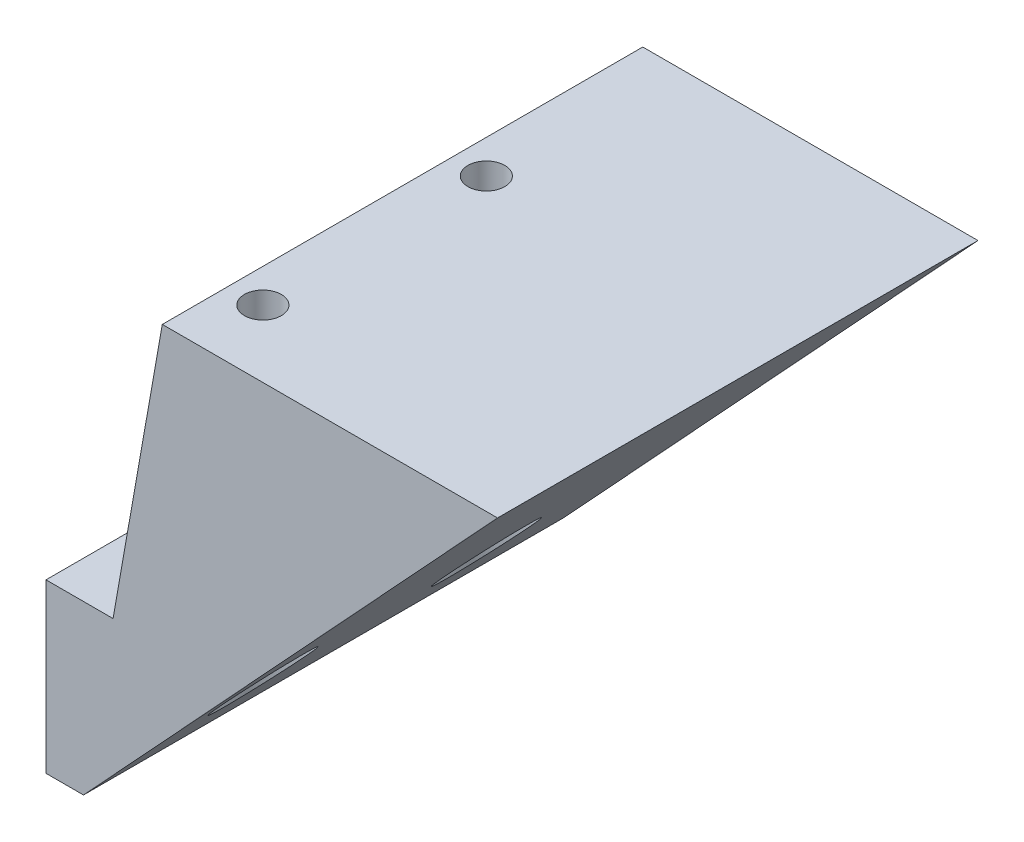
ISO-10303-21;
HEADER;
FILE_DESCRIPTION(('STEP AP214'),'2;1');
FILE_NAME('part.step','',(''),(''),'','','');
FILE_SCHEMA(('AUTOMOTIVE_DESIGN { 1 0 10303 214 1 1 1 1 }'));
ENDSEC;
DATA;
#1=APPLICATION_CONTEXT('core data for automotive mechanical design processes');
#2=APPLICATION_PROTOCOL_DEFINITION('international standard','automotive_design',2000,#1);
#3=PRODUCT_CONTEXT('',#1,'mechanical');
#4=PRODUCT('Part','Part','',(#3));
#5=PRODUCT_RELATED_PRODUCT_CATEGORY('part','',(#4));
#6=PRODUCT_DEFINITION_FORMATION('','',#4);
#7=PRODUCT_DEFINITION_CONTEXT('part definition',#1,'design');
#8=PRODUCT_DEFINITION('design','',#6,#7);
#9=PRODUCT_DEFINITION_SHAPE('','',#8);
#10=(LENGTH_UNIT() NAMED_UNIT(*) SI_UNIT(.MILLI.,.METRE.));
#11=(NAMED_UNIT(*) PLANE_ANGLE_UNIT() SI_UNIT($,.RADIAN.));
#12=(NAMED_UNIT(*) SI_UNIT($,.STERADIAN.) SOLID_ANGLE_UNIT());
#13=UNCERTAINTY_MEASURE_WITH_UNIT(LENGTH_MEASURE(1.E-05),#10,'distance_accuracy_value','');
#14=(GEOMETRIC_REPRESENTATION_CONTEXT(3) GLOBAL_UNCERTAINTY_ASSIGNED_CONTEXT((#13)) GLOBAL_UNIT_ASSIGNED_CONTEXT((#10,
#11,#12)) REPRESENTATION_CONTEXT('',''));
#15=CARTESIAN_POINT('',(0.,0.,0.));
#16=DIRECTION('',(0.,0.,1.));
#17=DIRECTION('',(1.,0.,0.));
#18=AXIS2_PLACEMENT_3D('',#15,#16,#17);
#19=CARTESIAN_POINT('',(10.0530792283384,0.,37.));
#20=DIRECTION('',(0.,1.,0.));
#21=DIRECTION('',(-1.,0.,0.));
#22=AXIS2_PLACEMENT_3D('',#19,#20,#21);
#23=CYLINDRICAL_SURFACE('',#22,1.65);
#24=CARTESIAN_POINT('',(10.0530792283384,40.,37.));
#25=DIRECTION('',(0.,1.,0.));
#26=DIRECTION('',(-1.,0.,0.));
#27=AXIS2_PLACEMENT_3D('',#24,#25,#26);
#28=CIRCLE('',#27,1.65);
#29=CARTESIAN_POINT('',(8.40307922833843,40.,37.));
#30=VERTEX_POINT('',#29);
#31=EDGE_CURVE('E137',#30,#30,#28,.T.);
#32=ORIENTED_EDGE('',*,*,#31,.T.);
#33=EDGE_LOOP('',(#32));
#34=FACE_BOUND('',#33,.T.);
#35=CARTESIAN_POINT('',(10.0530792283384,15.,37.));
#36=DIRECTION('',(0.,-1.,0.));
#37=DIRECTION('',(0.,0.,-1.));
#38=AXIS2_PLACEMENT_3D('',#35,#36,#37);
#39=CIRCLE('',#38,1.65);
#40=CARTESIAN_POINT('',(10.0530792283384,15.,35.35));
#41=VERTEX_POINT('',#40);
#42=EDGE_CURVE('E112',#41,#41,#39,.F.);
#43=ORIENTED_EDGE('',*,*,#42,.F.);
#44=EDGE_LOOP('',(#43));
#45=FACE_BOUND('',#44,.T.);
#46=ADVANCED_FACE('F41',(#34,#45),#23,.F.);
#47=CARTESIAN_POINT('',(10.0530792283384,0.,17.));
#48=DIRECTION('',(0.,1.,0.));
#49=DIRECTION('',(-1.,0.,0.));
#50=AXIS2_PLACEMENT_3D('',#47,#48,#49);
#51=CYLINDRICAL_SURFACE('',#50,1.65);
#52=CARTESIAN_POINT('',(10.0530792283384,40.,17.));
#53=DIRECTION('',(0.,1.,0.));
#54=DIRECTION('',(-1.,0.,0.));
#55=AXIS2_PLACEMENT_3D('',#52,#53,#54);
#56=CIRCLE('',#55,1.65);
#57=CARTESIAN_POINT('',(8.40307922833843,40.,17.));
#58=VERTEX_POINT('',#57);
#59=EDGE_CURVE('E142',#58,#58,#56,.T.);
#60=ORIENTED_EDGE('',*,*,#59,.T.);
#61=EDGE_LOOP('',(#60));
#62=FACE_BOUND('',#61,.T.);
#63=CARTESIAN_POINT('',(10.0530792283384,15.,17.));
#64=DIRECTION('',(0.,-1.,0.));
#65=DIRECTION('',(0.,0.,-1.));
#66=AXIS2_PLACEMENT_3D('',#63,#64,#65);
#67=CIRCLE('',#66,1.65);
#68=CARTESIAN_POINT('',(10.0530792283384,15.,15.35));
#69=VERTEX_POINT('',#68);
#70=EDGE_CURVE('E109',#69,#69,#67,.F.);
#71=ORIENTED_EDGE('',*,*,#70,.F.);
#72=EDGE_LOOP('',(#71));
#73=FACE_BOUND('',#72,.T.);
#74=ADVANCED_FACE('F199',(#62,#73),#51,.F.);
#75=CARTESIAN_POINT('',(37.0530792283384,40.,43.));
#76=DIRECTION('',(-0.733613981813898,0.67956642477918,0.));
#77=DIRECTION('',(-0.67956642477918,-0.733613981813898,0.));
#78=AXIS2_PLACEMENT_3D('',#75,#76,#77);
#79=PLANE('',#78);
#80=CARTESIAN_POINT('',(10.0530792283384,10.8526248697299,37.));
#81=DIRECTION('',(-0.733613981813898,0.67956642477918,0.));
#82=DIRECTION('',(-0.67956642477918,-0.733613981813898,0.));
#83=AXIS2_PLACEMENT_3D('',#80,#81,#82);
#84=ELLIPSE('',#83,5.15034273674909,3.5);
#85=CARTESIAN_POINT('',(6.55307922833842,7.07426142691707,37.));
#86=VERTEX_POINT('',#85);
#87=EDGE_CURVE('E45',#86,#86,#84,.T.);
#88=ORIENTED_EDGE('',*,*,#87,.T.);
#89=EDGE_LOOP('',(#88));
#90=FACE_BOUND('',#89,.T.);
#91=CARTESIAN_POINT('',(10.0530792283384,10.8526248697299,17.));
#92=DIRECTION('',(-0.733613981813898,0.67956642477918,0.));
#93=DIRECTION('',(-0.67956642477918,-0.733613981813898,0.));
#94=AXIS2_PLACEMENT_3D('',#91,#92,#93);
#95=ELLIPSE('',#94,5.15034273674909,3.5);
#96=CARTESIAN_POINT('',(6.55307922833842,7.07426142691707,17.));
#97=VERTEX_POINT('',#96);
#98=EDGE_CURVE('E115',#97,#97,#95,.T.);
#99=ORIENTED_EDGE('',*,*,#98,.T.);
#100=EDGE_LOOP('',(#99));
#101=FACE_BOUND('',#100,.T.);
#102=DIRECTION('',(0.67956642477918,0.733613981813898,0.));
#103=VECTOR('',#102,1.);
#104=CARTESIAN_POINT('',(37.0530792283384,40.,0.));
#105=LINE('',#104,#103);
#106=CARTESIAN_POINT('',(0.,0.,0.));
#107=VERTEX_POINT('',#106);
#108=CARTESIAN_POINT('',(37.0530792283384,40.,0.));
#109=VERTEX_POINT('',#108);
#110=EDGE_CURVE('E88',#107,#109,#105,.T.);
#111=ORIENTED_EDGE('',*,*,#110,.T.);
#112=DIRECTION('',(0.,0.,-1.));
#113=VECTOR('',#112,1.);
#114=CARTESIAN_POINT('',(37.0530792283384,40.,43.));
#115=LINE('',#114,#113);
#116=CARTESIAN_POINT('',(37.0530792283384,40.,43.));
#117=VERTEX_POINT('',#116);
#118=EDGE_CURVE('E11',#117,#109,#115,.T.);
#119=ORIENTED_EDGE('',*,*,#118,.F.);
#120=DIRECTION('',(0.67956642477918,0.733613981813898,0.));
#121=VECTOR('',#120,1.);
#122=CARTESIAN_POINT('',(37.0530792283384,40.,43.));
#123=LINE('',#122,#121);
#124=CARTESIAN_POINT('',(0.,0.,43.));
#125=VERTEX_POINT('',#124);
#126=EDGE_CURVE('E102',#125,#117,#123,.T.);
#127=ORIENTED_EDGE('',*,*,#126,.F.);
#128=DIRECTION('',(0.,0.,-1.));
#129=VECTOR('',#128,1.);
#130=CARTESIAN_POINT('',(0.,0.,43.));
#131=LINE('',#130,#129);
#132=EDGE_CURVE('E95',#125,#107,#131,.T.);
#133=ORIENTED_EDGE('',*,*,#132,.T.);
#134=EDGE_LOOP('',(#111,#119,#127,#133));
#135=FACE_BOUND('',#134,.T.);
#136=ADVANCED_FACE('F43',(#90,#101,#135),#79,.F.);
#137=CARTESIAN_POINT('',(7.05307922833844,40.,43.));
#138=DIRECTION('',(0.,-1.,0.));
#139=DIRECTION('',(1.,0.,0.));
#140=AXIS2_PLACEMENT_3D('',#137,#138,#139);
#141=PLANE('',#140);
#142=ORIENTED_EDGE('',*,*,#59,.F.);
#143=EDGE_LOOP('',(#142));
#144=FACE_BOUND('',#143,.T.);
#145=ORIENTED_EDGE('',*,*,#31,.F.);
#146=EDGE_LOOP('',(#145));
#147=FACE_BOUND('',#146,.T.);
#148=DIRECTION('',(-1.,0.,0.));
#149=VECTOR('',#148,1.);
#150=CARTESIAN_POINT('',(7.05307922833844,40.,0.));
#151=LINE('',#150,#149);
#152=CARTESIAN_POINT('',(7.05307922833844,40.,0.));
#153=VERTEX_POINT('',#152);
#154=EDGE_CURVE('E78',#109,#153,#151,.T.);
#155=ORIENTED_EDGE('',*,*,#154,.T.);
#156=DIRECTION('',(0.,0.,-1.));
#157=VECTOR('',#156,1.);
#158=CARTESIAN_POINT('',(7.05307922833844,40.,43.));
#159=LINE('',#158,#157);
#160=CARTESIAN_POINT('',(7.05307922833844,40.,43.));
#161=VERTEX_POINT('',#160);
#162=EDGE_CURVE('E50',#161,#153,#159,.T.);
#163=ORIENTED_EDGE('',*,*,#162,.F.);
#164=DIRECTION('',(-1.,0.,0.));
#165=VECTOR('',#164,1.);
#166=CARTESIAN_POINT('',(7.05307922833844,40.,43.));
#167=LINE('',#166,#165);
#168=EDGE_CURVE('E67',#117,#161,#167,.T.);
#169=ORIENTED_EDGE('',*,*,#168,.F.);
#170=ORIENTED_EDGE('',*,*,#118,.T.);
#171=EDGE_LOOP('',(#155,#163,#169,#170));
#172=FACE_BOUND('',#171,.T.);
#173=ADVANCED_FACE('F80',(#144,#147,#172),#141,.F.);
#174=CARTESIAN_POINT('',(0.,0.,43.));
#175=DIRECTION('',(0.984807753012209,-0.173648177666926,0.));
#176=DIRECTION('',(0.173648177666927,0.984807753012209,0.));
#177=AXIS2_PLACEMENT_3D('',#174,#175,#176);
#178=PLANE('',#177);
#179=DIRECTION('',(-0.173648177666926,-0.984807753012209,0.));
#180=VECTOR('',#179,1.);
#181=CARTESIAN_POINT('',(0.,0.,0.));
#182=LINE('',#181,#180);
#183=CARTESIAN_POINT('',(2.64490471062691,15.,0.));
#184=VERTEX_POINT('',#183);
#185=EDGE_CURVE('E87',#153,#184,#182,.T.);
#186=ORIENTED_EDGE('',*,*,#185,.T.);
#187=DIRECTION('',(0.,0.,1.));
#188=VECTOR('',#187,1.);
#189=CARTESIAN_POINT('',(2.64490471062691,15.,0.));
#190=LINE('',#189,#188);
#191=CARTESIAN_POINT('',(2.64490471062691,15.,43.));
#192=VERTEX_POINT('',#191);
#193=EDGE_CURVE('E140',#184,#192,#190,.T.);
#194=ORIENTED_EDGE('',*,*,#193,.T.);
#195=DIRECTION('',(-0.173648177666926,-0.984807753012209,0.));
#196=VECTOR('',#195,1.);
#197=CARTESIAN_POINT('',(0.,0.,43.));
#198=LINE('',#197,#196);
#199=EDGE_CURVE('E94',#161,#192,#198,.T.);
#200=ORIENTED_EDGE('',*,*,#199,.F.);
#201=ORIENTED_EDGE('',*,*,#162,.T.);
#202=EDGE_LOOP('',(#186,#194,#200,#201));
#203=FACE_BOUND('',#202,.T.);
#204=ADVANCED_FACE('F92',(#203),#178,.F.);
#205=CARTESIAN_POINT('',(0.,0.,43.));
#206=DIRECTION('',(0.,0.,1.));
#207=DIRECTION('',(1.,0.,0.));
#208=AXIS2_PLACEMENT_3D('',#205,#206,#207);
#209=PLANE('',#208);
#210=ORIENTED_EDGE('',*,*,#126,.T.);
#211=ORIENTED_EDGE('',*,*,#168,.T.);
#212=ORIENTED_EDGE('',*,*,#199,.T.);
#213=DIRECTION('',(-1.,0.,0.));
#214=VECTOR('',#213,1.);
#215=CARTESIAN_POINT('',(2.64490471062691,15.,43.));
#216=LINE('',#215,#214);
#217=CARTESIAN_POINT('',(-3.35509528937309,15.,43.));
#218=VERTEX_POINT('',#217);
#219=EDGE_CURVE('E58',#192,#218,#216,.T.);
#220=ORIENTED_EDGE('',*,*,#219,.T.);
#221=DIRECTION('',(0.,-1.,0.));
#222=VECTOR('',#221,1.);
#223=CARTESIAN_POINT('',(-3.35509528937309,15.,43.));
#224=LINE('',#223,#222);
#225=CARTESIAN_POINT('',(-3.35509528937308,0.,43.));
#226=VERTEX_POINT('',#225);
#227=EDGE_CURVE('E122',#218,#226,#224,.T.);
#228=ORIENTED_EDGE('',*,*,#227,.T.);
#229=DIRECTION('',(1.,0.,0.));
#230=VECTOR('',#229,1.);
#231=CARTESIAN_POINT('',(-3.35509528937308,0.,43.));
#232=LINE('',#231,#230);
#233=EDGE_CURVE('E126',#226,#125,#232,.T.);
#234=ORIENTED_EDGE('',*,*,#233,.T.);
#235=EDGE_LOOP('',(#210,#211,#212,#220,#228,#234));
#236=FACE_BOUND('',#235,.T.);
#237=ADVANCED_FACE('F211',(#236),#209,.T.);
#238=CARTESIAN_POINT('',(0.,0.,0.));
#239=DIRECTION('',(0.,0.,1.));
#240=DIRECTION('',(1.,0.,0.));
#241=AXIS2_PLACEMENT_3D('',#238,#239,#240);
#242=PLANE('',#241);
#243=ORIENTED_EDGE('',*,*,#110,.F.);
#244=DIRECTION('',(1.,0.,0.));
#245=VECTOR('',#244,1.);
#246=CARTESIAN_POINT('',(-3.35509528937308,0.,0.));
#247=LINE('',#246,#245);
#248=CARTESIAN_POINT('',(-3.35509528937308,0.,0.));
#249=VERTEX_POINT('',#248);
#250=EDGE_CURVE('E129',#249,#107,#247,.T.);
#251=ORIENTED_EDGE('',*,*,#250,.F.);
#252=DIRECTION('',(0.,-1.,0.));
#253=VECTOR('',#252,1.);
#254=CARTESIAN_POINT('',(-3.35509528937309,15.,0.));
#255=LINE('',#254,#253);
#256=CARTESIAN_POINT('',(-3.35509528937309,15.,0.));
#257=VERTEX_POINT('',#256);
#258=EDGE_CURVE('E171',#257,#249,#255,.T.);
#259=ORIENTED_EDGE('',*,*,#258,.F.);
#260=DIRECTION('',(-1.,0.,0.));
#261=VECTOR('',#260,1.);
#262=CARTESIAN_POINT('',(2.64490471062691,15.,0.));
#263=LINE('',#262,#261);
#264=EDGE_CURVE('E101',#184,#257,#263,.T.);
#265=ORIENTED_EDGE('',*,*,#264,.F.);
#266=ORIENTED_EDGE('',*,*,#185,.F.);
#267=ORIENTED_EDGE('',*,*,#154,.F.);
#268=EDGE_LOOP('',(#243,#251,#259,#265,#266,#267));
#269=FACE_BOUND('',#268,.T.);
#270=ADVANCED_FACE('F98',(#269),#242,.F.);
#271=CARTESIAN_POINT('',(-3.35509528937308,0.,0.));
#272=DIRECTION('',(0.,-1.,0.));
#273=DIRECTION('',(0.,0.,-1.));
#274=AXIS2_PLACEMENT_3D('',#271,#272,#273);
#275=PLANE('',#274);
#276=ORIENTED_EDGE('',*,*,#233,.F.);
#277=DIRECTION('',(0.,0.,1.));
#278=VECTOR('',#277,1.);
#279=CARTESIAN_POINT('',(-3.35509528937308,0.,0.));
#280=LINE('',#279,#278);
#281=EDGE_CURVE('E134',#249,#226,#280,.T.);
#282=ORIENTED_EDGE('',*,*,#281,.F.);
#283=ORIENTED_EDGE('',*,*,#250,.T.);
#284=ORIENTED_EDGE('',*,*,#132,.F.);
#285=EDGE_LOOP('',(#276,#282,#283,#284));
#286=FACE_BOUND('',#285,.T.);
#287=ADVANCED_FACE('F216',(#286),#275,.T.);
#288=CARTESIAN_POINT('',(-3.35509528937309,15.,0.));
#289=DIRECTION('',(-1.,0.,0.));
#290=DIRECTION('',(0.,-1.,0.));
#291=AXIS2_PLACEMENT_3D('',#288,#289,#290);
#292=PLANE('',#291);
#293=ORIENTED_EDGE('',*,*,#227,.F.);
#294=DIRECTION('',(0.,0.,1.));
#295=VECTOR('',#294,1.);
#296=CARTESIAN_POINT('',(-3.35509528937309,15.,0.));
#297=LINE('',#296,#295);
#298=EDGE_CURVE('E138',#257,#218,#297,.T.);
#299=ORIENTED_EDGE('',*,*,#298,.F.);
#300=ORIENTED_EDGE('',*,*,#258,.T.);
#301=ORIENTED_EDGE('',*,*,#281,.T.);
#302=EDGE_LOOP('',(#293,#299,#300,#301));
#303=FACE_BOUND('',#302,.T.);
#304=ADVANCED_FACE('F170',(#303),#292,.T.);
#305=CARTESIAN_POINT('',(2.64490471062691,15.,0.));
#306=DIRECTION('',(0.,1.,0.));
#307=DIRECTION('',(0.,0.,1.));
#308=AXIS2_PLACEMENT_3D('',#305,#306,#307);
#309=PLANE('',#308);
#310=ORIENTED_EDGE('',*,*,#219,.F.);
#311=ORIENTED_EDGE('',*,*,#193,.F.);
#312=ORIENTED_EDGE('',*,*,#264,.T.);
#313=ORIENTED_EDGE('',*,*,#298,.T.);
#314=EDGE_LOOP('',(#310,#311,#312,#313));
#315=FACE_BOUND('',#314,.T.);
#316=ADVANCED_FACE('F172',(#315),#309,.T.);
#317=CARTESIAN_POINT('',(10.0530792283384,15.,17.));
#318=DIRECTION('',(0.,-1.,0.));
#319=DIRECTION('',(0.,0.,-1.));
#320=AXIS2_PLACEMENT_3D('',#317,#318,#319);
#321=CYLINDRICAL_SURFACE('',#320,3.5);
#322=CARTESIAN_POINT('',(10.0530792283384,15.,17.));
#323=DIRECTION('',(0.,-1.,0.));
#324=DIRECTION('',(0.,0.,-1.));
#325=AXIS2_PLACEMENT_3D('',#322,#323,#324);
#326=CIRCLE('',#325,3.5);
#327=CARTESIAN_POINT('',(10.0530792283384,15.,13.5));
#328=VERTEX_POINT('',#327);
#329=EDGE_CURVE('E175',#328,#328,#326,.T.);
#330=ORIENTED_EDGE('',*,*,#329,.F.);
#331=EDGE_LOOP('',(#330));
#332=FACE_BOUND('',#331,.T.);
#333=ORIENTED_EDGE('',*,*,#98,.F.);
#334=EDGE_LOOP('',(#333));
#335=FACE_BOUND('',#334,.T.);
#336=ADVANCED_FACE('F194',(#332,#335),#321,.F.);
#337=CARTESIAN_POINT('',(10.0530792283384,15.,17.));
#338=DIRECTION('',(0.,-1.,0.));
#339=DIRECTION('',(0.,0.,-1.));
#340=AXIS2_PLACEMENT_3D('',#337,#338,#339);
#341=PLANE('',#340);
#342=ORIENTED_EDGE('',*,*,#329,.T.);
#343=EDGE_LOOP('',(#342));
#344=FACE_BOUND('',#343,.T.);
#345=ORIENTED_EDGE('',*,*,#70,.T.);
#346=EDGE_LOOP('',(#345));
#347=FACE_BOUND('',#346,.T.);
#348=ADVANCED_FACE('F187',(#344,#347),#341,.T.);
#349=CARTESIAN_POINT('',(10.0530792283384,15.,37.));
#350=DIRECTION('',(0.,-1.,0.));
#351=DIRECTION('',(0.,0.,-1.));
#352=AXIS2_PLACEMENT_3D('',#349,#350,#351);
#353=CYLINDRICAL_SURFACE('',#352,3.5);
#354=CARTESIAN_POINT('',(10.0530792283384,15.,37.));
#355=DIRECTION('',(0.,-1.,0.));
#356=DIRECTION('',(0.,0.,-1.));
#357=AXIS2_PLACEMENT_3D('',#354,#355,#356);
#358=CIRCLE('',#357,3.5);
#359=CARTESIAN_POINT('',(10.0530792283384,15.,33.5));
#360=VERTEX_POINT('',#359);
#361=EDGE_CURVE('E113',#360,#360,#358,.T.);
#362=ORIENTED_EDGE('',*,*,#361,.F.);
#363=EDGE_LOOP('',(#362));
#364=FACE_BOUND('',#363,.T.);
#365=ORIENTED_EDGE('',*,*,#87,.F.);
#366=EDGE_LOOP('',(#365));
#367=FACE_BOUND('',#366,.T.);
#368=ADVANCED_FACE('F184',(#364,#367),#353,.F.);
#369=CARTESIAN_POINT('',(10.0530792283384,15.,37.));
#370=DIRECTION('',(0.,-1.,0.));
#371=DIRECTION('',(0.,0.,-1.));
#372=AXIS2_PLACEMENT_3D('',#369,#370,#371);
#373=PLANE('',#372);
#374=ORIENTED_EDGE('',*,*,#361,.T.);
#375=EDGE_LOOP('',(#374));
#376=FACE_BOUND('',#375,.T.);
#377=ORIENTED_EDGE('',*,*,#42,.T.);
#378=EDGE_LOOP('',(#377));
#379=FACE_BOUND('',#378,.T.);
#380=ADVANCED_FACE('F181',(#376,#379),#373,.T.);
#381=CLOSED_SHELL('',(#46,#74,#136,#173,#204,#237,#270,#287,#304,#316,#336,#348,#368,#380));
#382=MANIFOLD_SOLID_BREP('B2',#381);
#383=ADVANCED_BREP_SHAPE_REPRESENTATION('',(#18,#382),#14);
#384=SHAPE_DEFINITION_REPRESENTATION(#9,#383);
ENDSEC;
END-ISO-10303-21;
